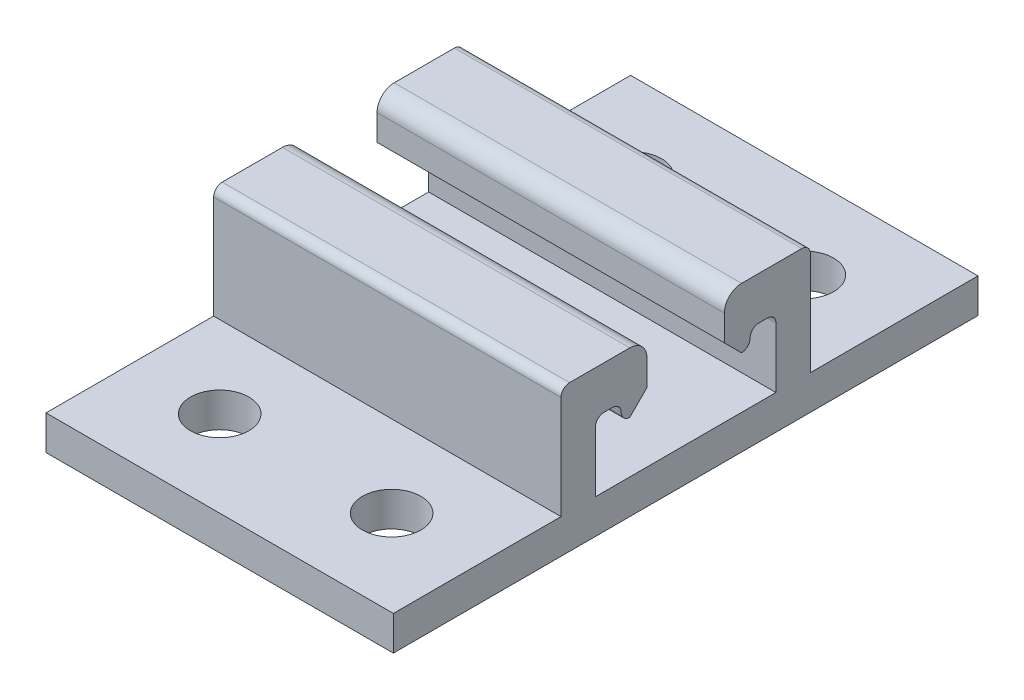
ISO-10303-21;
HEADER;
FILE_DESCRIPTION(('STEP AP214'),'2;1');
FILE_NAME('part.step','',(''),(''),'','','');
FILE_SCHEMA(('AUTOMOTIVE_DESIGN { 1 0 10303 214 1 1 1 1 }'));
ENDSEC;
DATA;
#1=APPLICATION_CONTEXT('core data for automotive mechanical design processes');
#2=APPLICATION_PROTOCOL_DEFINITION('international standard','automotive_design',2000,#1);
#3=PRODUCT_CONTEXT('',#1,'mechanical');
#4=PRODUCT('Part','Part','',(#3));
#5=PRODUCT_RELATED_PRODUCT_CATEGORY('part','',(#4));
#6=PRODUCT_DEFINITION_FORMATION('','',#4);
#7=PRODUCT_DEFINITION_CONTEXT('part definition',#1,'design');
#8=PRODUCT_DEFINITION('design','',#6,#7);
#9=PRODUCT_DEFINITION_SHAPE('','',#8);
#10=(LENGTH_UNIT() NAMED_UNIT(*) SI_UNIT(.MILLI.,.METRE.));
#11=(NAMED_UNIT(*) PLANE_ANGLE_UNIT() SI_UNIT($,.RADIAN.));
#12=(NAMED_UNIT(*) SI_UNIT($,.STERADIAN.) SOLID_ANGLE_UNIT());
#13=UNCERTAINTY_MEASURE_WITH_UNIT(LENGTH_MEASURE(1.E-05),#10,'distance_accuracy_value','');
#14=(GEOMETRIC_REPRESENTATION_CONTEXT(3) GLOBAL_UNCERTAINTY_ASSIGNED_CONTEXT((#13)) GLOBAL_UNIT_ASSIGNED_CONTEXT((#10,
#11,#12)) REPRESENTATION_CONTEXT('',''));
#15=CARTESIAN_POINT('',(0.,0.,0.));
#16=DIRECTION('',(0.,0.,1.));
#17=DIRECTION('',(1.,0.,0.));
#18=AXIS2_PLACEMENT_3D('',#15,#16,#17);
#19=CARTESIAN_POINT('',(0.,0.,0.));
#20=DIRECTION('',(0.,-1.,0.));
#21=DIRECTION('',(0.,0.,-1.));
#22=AXIS2_PLACEMENT_3D('',#19,#20,#21);
#23=PLANE('',#22);
#24=DIRECTION('',(0.,0.,-1.));
#25=VECTOR('',#24,1.);
#26=CARTESIAN_POINT('',(10.1,0.,17.));
#27=LINE('',#26,#25);
#28=CARTESIAN_POINT('',(10.1,0.,17.));
#29=VERTEX_POINT('',#28);
#30=CARTESIAN_POINT('',(10.1,0.,-17.));
#31=VERTEX_POINT('',#30);
#32=EDGE_CURVE('E325',#29,#31,#27,.T.);
#33=ORIENTED_EDGE('',*,*,#32,.F.);
#34=DIRECTION('',(1.,0.,0.));
#35=VECTOR('',#34,1.);
#36=CARTESIAN_POINT('',(-10.1,0.,17.));
#37=LINE('',#36,#35);
#38=CARTESIAN_POINT('',(-10.1,0.,17.));
#39=VERTEX_POINT('',#38);
#40=EDGE_CURVE('E343',#39,#29,#37,.T.);
#41=ORIENTED_EDGE('',*,*,#40,.F.);
#42=DIRECTION('',(0.,0.,1.));
#43=VECTOR('',#42,1.);
#44=CARTESIAN_POINT('',(-10.1,0.,17.));
#45=LINE('',#44,#43);
#46=CARTESIAN_POINT('',(-10.1,0.,-17.));
#47=VERTEX_POINT('',#46);
#48=EDGE_CURVE('E336',#47,#39,#45,.T.);
#49=ORIENTED_EDGE('',*,*,#48,.F.);
#50=DIRECTION('',(-1.,0.,0.));
#51=VECTOR('',#50,1.);
#52=CARTESIAN_POINT('',(-10.1,0.,-17.));
#53=LINE('',#52,#51);
#54=EDGE_CURVE('E331',#31,#47,#53,.T.);
#55=ORIENTED_EDGE('',*,*,#54,.F.);
#56=EDGE_LOOP('',(#33,#41,#49,#55));
#57=FACE_BOUND('',#56,.T.);
#58=CARTESIAN_POINT('',(5.,0.,12.));
#59=DIRECTION('',(0.,1.,0.));
#60=DIRECTION('',(0.,0.,1.));
#61=AXIS2_PLACEMENT_3D('',#58,#59,#60);
#62=CIRCLE('',#61,1.7);
#63=CARTESIAN_POINT('',(5.,0.,13.7));
#64=VERTEX_POINT('',#63);
#65=EDGE_CURVE('E266',#64,#64,#62,.T.);
#66=ORIENTED_EDGE('',*,*,#65,.T.);
#67=EDGE_LOOP('',(#66));
#68=FACE_BOUND('',#67,.T.);
#69=CARTESIAN_POINT('',(-5.,0.,12.));
#70=DIRECTION('',(0.,1.,0.));
#71=DIRECTION('',(0.,0.,1.));
#72=AXIS2_PLACEMENT_3D('',#69,#70,#71);
#73=CIRCLE('',#72,1.7);
#74=CARTESIAN_POINT('',(-5.,0.,13.7));
#75=VERTEX_POINT('',#74);
#76=EDGE_CURVE('E260',#75,#75,#73,.T.);
#77=ORIENTED_EDGE('',*,*,#76,.T.);
#78=EDGE_LOOP('',(#77));
#79=FACE_BOUND('',#78,.T.);
#80=CARTESIAN_POINT('',(5.,0.,-12.));
#81=DIRECTION('',(0.,1.,0.));
#82=DIRECTION('',(0.,0.,1.));
#83=AXIS2_PLACEMENT_3D('',#80,#81,#82);
#84=CIRCLE('',#83,1.7);
#85=CARTESIAN_POINT('',(5.,0.,-10.3));
#86=VERTEX_POINT('',#85);
#87=EDGE_CURVE('E414',#86,#86,#84,.T.);
#88=ORIENTED_EDGE('',*,*,#87,.T.);
#89=EDGE_LOOP('',(#88));
#90=FACE_BOUND('',#89,.T.);
#91=CARTESIAN_POINT('',(-5.,0.,-12.));
#92=DIRECTION('',(0.,1.,0.));
#93=DIRECTION('',(0.,0.,1.));
#94=AXIS2_PLACEMENT_3D('',#91,#92,#93);
#95=CIRCLE('',#94,1.7);
#96=CARTESIAN_POINT('',(-5.,0.,-10.3));
#97=VERTEX_POINT('',#96);
#98=EDGE_CURVE('E695',#97,#97,#95,.T.);
#99=ORIENTED_EDGE('',*,*,#98,.T.);
#100=EDGE_LOOP('',(#99));
#101=FACE_BOUND('',#100,.T.);
#102=ADVANCED_FACE('F34',(#57,#68,#79,#90,#101),#23,.T.);
#103=CARTESIAN_POINT('',(0.,2.,0.));
#104=DIRECTION('',(0.,-1.,0.));
#105=DIRECTION('',(0.,0.,-1.));
#106=AXIS2_PLACEMENT_3D('',#103,#104,#105);
#107=PLANE('',#106);
#108=DIRECTION('',(1.,0.,0.));
#109=VECTOR('',#108,1.);
#110=CARTESIAN_POINT('',(-18.3006097334284,2.,-5.25));
#111=LINE('',#110,#109);
#112=CARTESIAN_POINT('',(-10.1,2.,-5.25));
#113=VERTEX_POINT('',#112);
#114=CARTESIAN_POINT('',(10.1,2.,-5.25));
#115=VERTEX_POINT('',#114);
#116=EDGE_CURVE('E223',#113,#115,#111,.T.);
#117=ORIENTED_EDGE('',*,*,#116,.F.);
#118=DIRECTION('',(0.,0.,1.));
#119=VECTOR('',#118,1.);
#120=CARTESIAN_POINT('',(-10.1,2.,17.));
#121=LINE('',#120,#119);
#122=CARTESIAN_POINT('',(-10.1,2.,5.25));
#123=VERTEX_POINT('',#122);
#124=EDGE_CURVE('E233',#113,#123,#121,.T.);
#125=ORIENTED_EDGE('',*,*,#124,.T.);
#126=DIRECTION('',(1.,0.,0.));
#127=VECTOR('',#126,1.);
#128=CARTESIAN_POINT('',(-18.3006097334284,2.,5.25));
#129=LINE('',#128,#127);
#130=CARTESIAN_POINT('',(10.1,2.,5.25));
#131=VERTEX_POINT('',#130);
#132=EDGE_CURVE('E294',#123,#131,#129,.T.);
#133=ORIENTED_EDGE('',*,*,#132,.T.);
#134=DIRECTION('',(0.,0.,-1.));
#135=VECTOR('',#134,1.);
#136=CARTESIAN_POINT('',(10.1,2.,17.));
#137=LINE('',#136,#135);
#138=EDGE_CURVE('E244',#131,#115,#137,.T.);
#139=ORIENTED_EDGE('',*,*,#138,.T.);
#140=EDGE_LOOP('',(#117,#125,#133,#139));
#141=FACE_BOUND('',#140,.T.);
#142=ADVANCED_FACE('F242',(#141),#107,.F.);
#143=CARTESIAN_POINT('',(-5.,2.,-12.));
#144=DIRECTION('',(0.,1.,0.));
#145=DIRECTION('',(0.,0.,1.));
#146=AXIS2_PLACEMENT_3D('',#143,#144,#145);
#147=CIRCLE('',#146,1.69999999999999);
#148=CARTESIAN_POINT('',(-5.,2.,-10.3));
#149=VERTEX_POINT('',#148);
#150=EDGE_CURVE('E690',#149,#149,#147,.T.);
#151=ORIENTED_EDGE('',*,*,#150,.F.);
#152=EDGE_LOOP('',(#151));
#153=FACE_BOUND('',#152,.T.);
#154=CARTESIAN_POINT('',(5.,2.,-12.));
#155=DIRECTION('',(0.,1.,0.));
#156=DIRECTION('',(0.,0.,1.));
#157=AXIS2_PLACEMENT_3D('',#154,#155,#156);
#158=CIRCLE('',#157,1.69999999999999);
#159=CARTESIAN_POINT('',(5.,2.,-10.3));
#160=VERTEX_POINT('',#159);
#161=EDGE_CURVE('E693',#160,#160,#158,.T.);
#162=ORIENTED_EDGE('',*,*,#161,.F.);
#163=EDGE_LOOP('',(#162));
#164=FACE_BOUND('',#163,.T.);
#165=DIRECTION('',(1.,0.,0.));
#166=VECTOR('',#165,1.);
#167=CARTESIAN_POINT('',(-18.3006097334284,2.,-7.25));
#168=LINE('',#167,#166);
#169=CARTESIAN_POINT('',(-10.1,2.,-7.25));
#170=VERTEX_POINT('',#169);
#171=CARTESIAN_POINT('',(10.1,2.,-7.25));
#172=VERTEX_POINT('',#171);
#173=EDGE_CURVE('E245',#170,#172,#168,.T.);
#174=ORIENTED_EDGE('',*,*,#173,.T.);
#175=CARTESIAN_POINT('',(10.1,2.,-17.));
#176=VERTEX_POINT('',#175);
#177=EDGE_CURVE('E345',#172,#176,#137,.T.);
#178=ORIENTED_EDGE('',*,*,#177,.T.);
#179=DIRECTION('',(-1.,0.,0.));
#180=VECTOR('',#179,1.);
#181=CARTESIAN_POINT('',(-10.1,2.,-17.));
#182=LINE('',#181,#180);
#183=CARTESIAN_POINT('',(-10.1,2.,-17.));
#184=VERTEX_POINT('',#183);
#185=EDGE_CURVE('E359',#176,#184,#182,.T.);
#186=ORIENTED_EDGE('',*,*,#185,.T.);
#187=EDGE_CURVE('E239',#184,#170,#121,.T.);
#188=ORIENTED_EDGE('',*,*,#187,.T.);
#189=EDGE_LOOP('',(#174,#178,#186,#188));
#190=FACE_BOUND('',#189,.T.);
#191=ADVANCED_FACE('F478',(#153,#164,#190),#107,.F.);
#192=CARTESIAN_POINT('',(-5.,2.,12.));
#193=DIRECTION('',(0.,1.,0.));
#194=DIRECTION('',(0.,0.,1.));
#195=AXIS2_PLACEMENT_3D('',#192,#193,#194);
#196=CIRCLE('',#195,1.69999999999999);
#197=CARTESIAN_POINT('',(-5.,2.,13.7));
#198=VERTEX_POINT('',#197);
#199=EDGE_CURVE('E257',#198,#198,#196,.T.);
#200=ORIENTED_EDGE('',*,*,#199,.F.);
#201=EDGE_LOOP('',(#200));
#202=FACE_BOUND('',#201,.T.);
#203=CARTESIAN_POINT('',(5.,2.,12.));
#204=DIRECTION('',(0.,1.,0.));
#205=DIRECTION('',(0.,0.,1.));
#206=AXIS2_PLACEMENT_3D('',#203,#204,#205);
#207=CIRCLE('',#206,1.69999999999999);
#208=CARTESIAN_POINT('',(5.,2.,13.7));
#209=VERTEX_POINT('',#208);
#210=EDGE_CURVE('E263',#209,#209,#207,.T.);
#211=ORIENTED_EDGE('',*,*,#210,.F.);
#212=EDGE_LOOP('',(#211));
#213=FACE_BOUND('',#212,.T.);
#214=DIRECTION('',(1.,0.,0.));
#215=VECTOR('',#214,1.);
#216=CARTESIAN_POINT('',(-18.3006097334284,2.,7.25));
#217=LINE('',#216,#215);
#218=CARTESIAN_POINT('',(-10.1,2.,7.25));
#219=VERTEX_POINT('',#218);
#220=CARTESIAN_POINT('',(10.1,2.,7.25));
#221=VERTEX_POINT('',#220);
#222=EDGE_CURVE('E288',#219,#221,#217,.T.);
#223=ORIENTED_EDGE('',*,*,#222,.F.);
#224=CARTESIAN_POINT('',(-10.1,2.,17.));
#225=VERTEX_POINT('',#224);
#226=EDGE_CURVE('E240',#219,#225,#121,.T.);
#227=ORIENTED_EDGE('',*,*,#226,.T.);
#228=DIRECTION('',(1.,0.,0.));
#229=VECTOR('',#228,1.);
#230=CARTESIAN_POINT('',(-10.1,2.,17.));
#231=LINE('',#230,#229);
#232=CARTESIAN_POINT('',(10.1,2.,17.));
#233=VERTEX_POINT('',#232);
#234=EDGE_CURVE('E339',#225,#233,#231,.T.);
#235=ORIENTED_EDGE('',*,*,#234,.T.);
#236=EDGE_CURVE('E356',#233,#221,#137,.T.);
#237=ORIENTED_EDGE('',*,*,#236,.T.);
#238=EDGE_LOOP('',(#223,#227,#235,#237));
#239=FACE_BOUND('',#238,.T.);
#240=ADVANCED_FACE('F480',(#202,#213,#239),#107,.F.);
#241=CARTESIAN_POINT('',(10.1,2.,17.));
#242=DIRECTION('',(-1.,0.,0.));
#243=DIRECTION('',(0.,0.,1.));
#244=AXIS2_PLACEMENT_3D('',#241,#242,#243);
#245=PLANE('',#244);
#246=DIRECTION('',(0.,0.,-1.));
#247=VECTOR('',#246,1.);
#248=CARTESIAN_POINT('',(10.1,8.5,-7.25));
#249=LINE('',#248,#247);
#250=CARTESIAN_POINT('',(10.1,8.5,-3.25));
#251=VERTEX_POINT('',#250);
#252=CARTESIAN_POINT('',(10.1,8.5,-6.75));
#253=VERTEX_POINT('',#252);
#254=EDGE_CURVE('E420',#251,#253,#249,.T.);
#255=ORIENTED_EDGE('',*,*,#254,.F.);
#256=CARTESIAN_POINT('',(10.1,7.5,-3.25));
#257=DIRECTION('',(-1.,0.,0.));
#258=DIRECTION('',(0.,0.,1.));
#259=AXIS2_PLACEMENT_3D('',#256,#257,#258);
#260=CIRCLE('',#259,1.);
#261=CARTESIAN_POINT('',(10.1,7.5,-2.25));
#262=VERTEX_POINT('',#261);
#263=EDGE_CURVE('E56',#251,#262,#260,.F.);
#264=ORIENTED_EDGE('',*,*,#263,.T.);
#265=DIRECTION('',(0.,1.,0.));
#266=VECTOR('',#265,1.);
#267=CARTESIAN_POINT('',(10.1,8.5,-2.25));
#268=LINE('',#267,#266);
#269=CARTESIAN_POINT('',(10.1,6.00000000000001,-2.25));
#270=VERTEX_POINT('',#269);
#271=EDGE_CURVE('E427',#270,#262,#268,.T.);
#272=ORIENTED_EDGE('',*,*,#271,.F.);
#273=DIRECTION('',(0.,0.707106781186549,0.707106781186546));
#274=VECTOR('',#273,1.);
#275=CARTESIAN_POINT('',(10.1,6.00000000000001,-2.25));
#276=LINE('',#275,#274);
#277=CARTESIAN_POINT('',(10.1,5.,-3.25));
#278=VERTEX_POINT('',#277);
#279=EDGE_CURVE('E371',#270,#278,#276,.F.);
#280=ORIENTED_EDGE('',*,*,#279,.T.);
#281=CARTESIAN_POINT('',(10.1,5.5,-3.25));
#282=DIRECTION('',(-1.,0.,0.));
#283=DIRECTION('',(0.,0.,1.));
#284=AXIS2_PLACEMENT_3D('',#281,#282,#283);
#285=CIRCLE('',#284,0.5);
#286=CARTESIAN_POINT('',(10.1,5.5,-3.75));
#287=VERTEX_POINT('',#286);
#288=EDGE_CURVE('E384',#278,#287,#285,.F.);
#289=ORIENTED_EDGE('',*,*,#288,.T.);
#290=CARTESIAN_POINT('',(10.1,5.5,-4.25));
#291=DIRECTION('',(-1.,0.,0.));
#292=DIRECTION('',(0.,0.,1.));
#293=AXIS2_PLACEMENT_3D('',#290,#291,#292);
#294=CIRCLE('',#293,0.5);
#295=CARTESIAN_POINT('',(10.1,6.,-4.25));
#296=VERTEX_POINT('',#295);
#297=EDGE_CURVE('E405',#287,#296,#294,.T.);
#298=ORIENTED_EDGE('',*,*,#297,.T.);
#299=DIRECTION('',(0.,0.,1.));
#300=VECTOR('',#299,1.);
#301=CARTESIAN_POINT('',(10.1,6.,-5.25));
#302=LINE('',#301,#300);
#303=CARTESIAN_POINT('',(10.1,6.,-4.75));
#304=VERTEX_POINT('',#303);
#305=EDGE_CURVE('E251',#304,#296,#302,.T.);
#306=ORIENTED_EDGE('',*,*,#305,.F.);
#307=CARTESIAN_POINT('',(10.1,5.5,-4.75));
#308=DIRECTION('',(-1.,0.,0.));
#309=DIRECTION('',(0.,0.,1.));
#310=AXIS2_PLACEMENT_3D('',#307,#308,#309);
#311=CIRCLE('',#310,0.5);
#312=CARTESIAN_POINT('',(10.1,5.5,-5.25));
#313=VERTEX_POINT('',#312);
#314=EDGE_CURVE('E401',#304,#313,#311,.T.);
#315=ORIENTED_EDGE('',*,*,#314,.T.);
#316=DIRECTION('',(0.,1.,0.));
#317=VECTOR('',#316,1.);
#318=CARTESIAN_POINT('',(10.1,6.,-5.25));
#319=LINE('',#318,#317);
#320=EDGE_CURVE('E246',#115,#313,#319,.T.);
#321=ORIENTED_EDGE('',*,*,#320,.F.);
#322=ORIENTED_EDGE('',*,*,#138,.F.);
#323=DIRECTION('',(0.,1.,0.));
#324=VECTOR('',#323,1.);
#325=CARTESIAN_POINT('',(10.1,6.,5.25));
#326=LINE('',#325,#324);
#327=CARTESIAN_POINT('',(10.1,5.5,5.25));
#328=VERTEX_POINT('',#327);
#329=EDGE_CURVE('E283',#131,#328,#326,.T.);
#330=ORIENTED_EDGE('',*,*,#329,.T.);
#331=CARTESIAN_POINT('',(10.1,5.5,4.75));
#332=DIRECTION('',(-1.,0.,0.));
#333=DIRECTION('',(0.,0.,1.));
#334=AXIS2_PLACEMENT_3D('',#331,#332,#333);
#335=CIRCLE('',#334,0.5);
#336=CARTESIAN_POINT('',(10.1,6.,4.75));
#337=VERTEX_POINT('',#336);
#338=EDGE_CURVE('E627',#328,#337,#335,.T.);
#339=ORIENTED_EDGE('',*,*,#338,.T.);
#340=DIRECTION('',(0.,0.,-1.));
#341=VECTOR('',#340,1.);
#342=CARTESIAN_POINT('',(10.1,6.,5.25));
#343=LINE('',#342,#341);
#344=CARTESIAN_POINT('',(10.1,6.,4.25));
#345=VERTEX_POINT('',#344);
#346=EDGE_CURVE('E279',#337,#345,#343,.T.);
#347=ORIENTED_EDGE('',*,*,#346,.T.);
#348=CARTESIAN_POINT('',(10.1,5.5,4.25));
#349=DIRECTION('',(-1.,0.,0.));
#350=DIRECTION('',(0.,0.,1.));
#351=AXIS2_PLACEMENT_3D('',#348,#349,#350);
#352=CIRCLE('',#351,0.5);
#353=CARTESIAN_POINT('',(10.1,5.5,3.75));
#354=VERTEX_POINT('',#353);
#355=EDGE_CURVE('E631',#345,#354,#352,.T.);
#356=ORIENTED_EDGE('',*,*,#355,.T.);
#357=CARTESIAN_POINT('',(10.1,5.5,3.25));
#358=DIRECTION('',(-1.,0.,0.));
#359=DIRECTION('',(0.,0.,1.));
#360=AXIS2_PLACEMENT_3D('',#357,#358,#359);
#361=CIRCLE('',#360,0.5);
#362=CARTESIAN_POINT('',(10.1,5.,3.25));
#363=VERTEX_POINT('',#362);
#364=EDGE_CURVE('E660',#354,#363,#361,.F.);
#365=ORIENTED_EDGE('',*,*,#364,.T.);
#366=DIRECTION('',(0.,-0.707106781186549,0.707106781186546));
#367=VECTOR('',#366,1.);
#368=CARTESIAN_POINT('',(10.1,5.,3.25));
#369=LINE('',#368,#367);
#370=CARTESIAN_POINT('',(10.1,6.00000000000001,2.25));
#371=VERTEX_POINT('',#370);
#372=EDGE_CURVE('E307',#363,#371,#369,.F.);
#373=ORIENTED_EDGE('',*,*,#372,.T.);
#374=DIRECTION('',(0.,1.,0.));
#375=VECTOR('',#374,1.);
#376=CARTESIAN_POINT('',(10.1,8.5,2.25));
#377=LINE('',#376,#375);
#378=CARTESIAN_POINT('',(10.1,7.5,2.25));
#379=VERTEX_POINT('',#378);
#380=EDGE_CURVE('E282',#371,#379,#377,.T.);
#381=ORIENTED_EDGE('',*,*,#380,.T.);
#382=CARTESIAN_POINT('',(10.1,7.5,3.25));
#383=DIRECTION('',(-1.,0.,0.));
#384=DIRECTION('',(0.,0.,1.));
#385=AXIS2_PLACEMENT_3D('',#382,#383,#384);
#386=CIRCLE('',#385,1.);
#387=CARTESIAN_POINT('',(10.1,8.5,3.25));
#388=VERTEX_POINT('',#387);
#389=EDGE_CURVE('E640',#379,#388,#386,.F.);
#390=ORIENTED_EDGE('',*,*,#389,.T.);
#391=DIRECTION('',(0.,0.,1.));
#392=VECTOR('',#391,1.);
#393=CARTESIAN_POINT('',(10.1,8.5,7.25));
#394=LINE('',#393,#392);
#395=CARTESIAN_POINT('',(10.1,8.5,6.75));
#396=VERTEX_POINT('',#395);
#397=EDGE_CURVE('E286',#388,#396,#394,.T.);
#398=ORIENTED_EDGE('',*,*,#397,.T.);
#399=CARTESIAN_POINT('',(10.1,8.,6.75));
#400=DIRECTION('',(-1.,0.,0.));
#401=DIRECTION('',(0.,0.,1.));
#402=AXIS2_PLACEMENT_3D('',#399,#400,#401);
#403=CIRCLE('',#402,0.5);
#404=CARTESIAN_POINT('',(10.1,8.,7.25));
#405=VERTEX_POINT('',#404);
#406=EDGE_CURVE('E316',#396,#405,#403,.F.);
#407=ORIENTED_EDGE('',*,*,#406,.T.);
#408=DIRECTION('',(0.,-1.,0.));
#409=VECTOR('',#408,1.);
#410=CARTESIAN_POINT('',(10.1,2.,7.25));
#411=LINE('',#410,#409);
#412=EDGE_CURVE('E301',#405,#221,#411,.T.);
#413=ORIENTED_EDGE('',*,*,#412,.T.);
#414=ORIENTED_EDGE('',*,*,#236,.F.);
#415=DIRECTION('',(0.,-1.,0.));
#416=VECTOR('',#415,1.);
#417=CARTESIAN_POINT('',(10.1,2.,17.));
#418=LINE('',#417,#416);
#419=EDGE_CURVE('E346',#233,#29,#418,.T.);
#420=ORIENTED_EDGE('',*,*,#419,.T.);
#421=ORIENTED_EDGE('',*,*,#32,.T.);
#422=DIRECTION('',(0.,-1.,0.));
#423=VECTOR('',#422,1.);
#424=CARTESIAN_POINT('',(10.1,2.,-17.));
#425=LINE('',#424,#423);
#426=EDGE_CURVE('E308',#176,#31,#425,.T.);
#427=ORIENTED_EDGE('',*,*,#426,.F.);
#428=ORIENTED_EDGE('',*,*,#177,.F.);
#429=DIRECTION('',(0.,-1.,0.));
#430=VECTOR('',#429,1.);
#431=CARTESIAN_POINT('',(10.1,2.,-7.25));
#432=LINE('',#431,#430);
#433=CARTESIAN_POINT('',(10.1,8.,-7.25));
#434=VERTEX_POINT('',#433);
#435=EDGE_CURVE('E413',#434,#172,#432,.T.);
#436=ORIENTED_EDGE('',*,*,#435,.F.);
#437=CARTESIAN_POINT('',(10.1,8.,-6.75));
#438=DIRECTION('',(-1.,0.,0.));
#439=DIRECTION('',(0.,0.,1.));
#440=AXIS2_PLACEMENT_3D('',#437,#438,#439);
#441=CIRCLE('',#440,0.5);
#442=EDGE_CURVE('E381',#434,#253,#441,.F.);
#443=ORIENTED_EDGE('',*,*,#442,.T.);
#444=EDGE_LOOP('',(#255,#264,#272,#280,#289,#298,#306,#315,#321,#322,#330,#339,#347,#356,#365,
#373,#381,#390,#398,#407,#413,#414,#420,#421,#427,#428,#436,#443));
#445=FACE_BOUND('',#444,.T.);
#446=ADVANCED_FACE('F424',(#445),#245,.F.);
#447=CARTESIAN_POINT('',(-10.1,2.,-17.));
#448=DIRECTION('',(0.,0.,1.));
#449=DIRECTION('',(1.,0.,0.));
#450=AXIS2_PLACEMENT_3D('',#447,#448,#449);
#451=PLANE('',#450);
#452=ORIENTED_EDGE('',*,*,#54,.T.);
#453=DIRECTION('',(0.,-1.,0.));
#454=VECTOR('',#453,1.);
#455=CARTESIAN_POINT('',(-10.1,2.,-17.));
#456=LINE('',#455,#454);
#457=EDGE_CURVE('E351',#184,#47,#456,.T.);
#458=ORIENTED_EDGE('',*,*,#457,.F.);
#459=ORIENTED_EDGE('',*,*,#185,.F.);
#460=ORIENTED_EDGE('',*,*,#426,.T.);
#461=EDGE_LOOP('',(#452,#458,#459,#460));
#462=FACE_BOUND('',#461,.T.);
#463=ADVANCED_FACE('F491',(#462),#451,.F.);
#464=CARTESIAN_POINT('',(-10.1,2.,17.));
#465=DIRECTION('',(1.,0.,0.));
#466=DIRECTION('',(0.,0.,-1.));
#467=AXIS2_PLACEMENT_3D('',#464,#465,#466);
#468=PLANE('',#467);
#469=DIRECTION('',(0.,-1.,0.));
#470=VECTOR('',#469,1.);
#471=CARTESIAN_POINT('',(-10.1,8.5,-2.25));
#472=LINE('',#471,#470);
#473=CARTESIAN_POINT('',(-10.1,7.5,-2.25));
#474=VERTEX_POINT('',#473);
#475=CARTESIAN_POINT('',(-10.1,6.00000000000001,-2.25));
#476=VERTEX_POINT('',#475);
#477=EDGE_CURVE('E256',#474,#476,#472,.T.);
#478=ORIENTED_EDGE('',*,*,#477,.F.);
#479=CARTESIAN_POINT('',(-10.1,7.5,-3.25));
#480=DIRECTION('',(1.,0.,0.));
#481=DIRECTION('',(0.,0.,-1.));
#482=AXIS2_PLACEMENT_3D('',#479,#480,#481);
#483=CIRCLE('',#482,1.);
#484=CARTESIAN_POINT('',(-10.1,8.5,-3.25));
#485=VERTEX_POINT('',#484);
#486=EDGE_CURVE('E11',#474,#485,#483,.F.);
#487=ORIENTED_EDGE('',*,*,#486,.T.);
#488=DIRECTION('',(0.,0.,1.));
#489=VECTOR('',#488,1.);
#490=CARTESIAN_POINT('',(-10.1,8.5,-7.25));
#491=LINE('',#490,#489);
#492=CARTESIAN_POINT('',(-10.1,8.5,-6.75));
#493=VERTEX_POINT('',#492);
#494=EDGE_CURVE('E249',#493,#485,#491,.T.);
#495=ORIENTED_EDGE('',*,*,#494,.F.);
#496=CARTESIAN_POINT('',(-10.1,8.,-6.75));
#497=DIRECTION('',(1.,0.,0.));
#498=DIRECTION('',(0.,0.,-1.));
#499=AXIS2_PLACEMENT_3D('',#496,#497,#498);
#500=CIRCLE('',#499,0.5);
#501=CARTESIAN_POINT('',(-10.1,8.,-7.25));
#502=VERTEX_POINT('',#501);
#503=EDGE_CURVE('E386',#493,#502,#500,.F.);
#504=ORIENTED_EDGE('',*,*,#503,.T.);
#505=DIRECTION('',(0.,1.,0.));
#506=VECTOR('',#505,1.);
#507=CARTESIAN_POINT('',(-10.1,2.,-7.25));
#508=LINE('',#507,#506);
#509=EDGE_CURVE('E229',#170,#502,#508,.T.);
#510=ORIENTED_EDGE('',*,*,#509,.F.);
#511=ORIENTED_EDGE('',*,*,#187,.F.);
#512=ORIENTED_EDGE('',*,*,#457,.T.);
#513=ORIENTED_EDGE('',*,*,#48,.T.);
#514=DIRECTION('',(0.,-1.,0.));
#515=VECTOR('',#514,1.);
#516=CARTESIAN_POINT('',(-10.1,2.,17.));
#517=LINE('',#516,#515);
#518=EDGE_CURVE('E348',#225,#39,#517,.T.);
#519=ORIENTED_EDGE('',*,*,#518,.F.);
#520=ORIENTED_EDGE('',*,*,#226,.F.);
#521=DIRECTION('',(0.,1.,0.));
#522=VECTOR('',#521,1.);
#523=CARTESIAN_POINT('',(-10.1,2.,7.25));
#524=LINE('',#523,#522);
#525=CARTESIAN_POINT('',(-10.1,8.,7.25));
#526=VERTEX_POINT('',#525);
#527=EDGE_CURVE('E278',#219,#526,#524,.T.);
#528=ORIENTED_EDGE('',*,*,#527,.T.);
#529=CARTESIAN_POINT('',(-10.1,8.,6.75));
#530=DIRECTION('',(1.,0.,0.));
#531=DIRECTION('',(0.,0.,-1.));
#532=AXIS2_PLACEMENT_3D('',#529,#530,#531);
#533=CIRCLE('',#532,0.5);
#534=CARTESIAN_POINT('',(-10.1,8.5,6.75));
#535=VERTEX_POINT('',#534);
#536=EDGE_CURVE('E613',#526,#535,#533,.F.);
#537=ORIENTED_EDGE('',*,*,#536,.T.);
#538=DIRECTION('',(0.,0.,-1.));
#539=VECTOR('',#538,1.);
#540=CARTESIAN_POINT('',(-10.1,8.5,7.25));
#541=LINE('',#540,#539);
#542=CARTESIAN_POINT('',(-10.1,8.5,3.25));
#543=VERTEX_POINT('',#542);
#544=EDGE_CURVE('E275',#535,#543,#541,.T.);
#545=ORIENTED_EDGE('',*,*,#544,.T.);
#546=CARTESIAN_POINT('',(-10.1,7.5,3.25));
#547=DIRECTION('',(1.,0.,0.));
#548=DIRECTION('',(0.,0.,-1.));
#549=AXIS2_PLACEMENT_3D('',#546,#547,#548);
#550=CIRCLE('',#549,1.);
#551=CARTESIAN_POINT('',(-10.1,7.5,2.25));
#552=VERTEX_POINT('',#551);
#553=EDGE_CURVE('E372',#543,#552,#550,.F.);
#554=ORIENTED_EDGE('',*,*,#553,.T.);
#555=DIRECTION('',(0.,-1.,0.));
#556=VECTOR('',#555,1.);
#557=CARTESIAN_POINT('',(-10.1,8.5,2.25));
#558=LINE('',#557,#556);
#559=CARTESIAN_POINT('',(-10.1,6.00000000000001,2.25));
#560=VERTEX_POINT('',#559);
#561=EDGE_CURVE('E273',#552,#560,#558,.T.);
#562=ORIENTED_EDGE('',*,*,#561,.T.);
#563=DIRECTION('',(0.,0.707106781186549,-0.707106781186546));
#564=VECTOR('',#563,1.);
#565=CARTESIAN_POINT('',(-10.1,5.,3.25));
#566=LINE('',#565,#564);
#567=CARTESIAN_POINT('',(-10.1,5.,3.25));
#568=VERTEX_POINT('',#567);
#569=EDGE_CURVE('E313',#560,#568,#566,.F.);
#570=ORIENTED_EDGE('',*,*,#569,.T.);
#571=CARTESIAN_POINT('',(-10.1,5.5,3.25));
#572=DIRECTION('',(1.,0.,0.));
#573=DIRECTION('',(0.,0.,-1.));
#574=AXIS2_PLACEMENT_3D('',#571,#572,#573);
#575=CIRCLE('',#574,0.5);
#576=CARTESIAN_POINT('',(-10.1,5.5,3.75));
#577=VERTEX_POINT('',#576);
#578=EDGE_CURVE('E620',#568,#577,#575,.F.);
#579=ORIENTED_EDGE('',*,*,#578,.T.);
#580=CARTESIAN_POINT('',(-10.1,5.5,4.25));
#581=DIRECTION('',(1.,0.,0.));
#582=DIRECTION('',(0.,0.,-1.));
#583=AXIS2_PLACEMENT_3D('',#580,#581,#582);
#584=CIRCLE('',#583,0.5);
#585=CARTESIAN_POINT('',(-10.1,6.,4.25));
#586=VERTEX_POINT('',#585);
#587=EDGE_CURVE('E633',#577,#586,#584,.T.);
#588=ORIENTED_EDGE('',*,*,#587,.T.);
#589=DIRECTION('',(0.,0.,1.));
#590=VECTOR('',#589,1.);
#591=CARTESIAN_POINT('',(-10.1,6.,5.25));
#592=LINE('',#591,#590);
#593=CARTESIAN_POINT('',(-10.1,6.,4.75));
#594=VERTEX_POINT('',#593);
#595=EDGE_CURVE('E270',#586,#594,#592,.T.);
#596=ORIENTED_EDGE('',*,*,#595,.T.);
#597=CARTESIAN_POINT('',(-10.1,5.5,4.75));
#598=DIRECTION('',(1.,0.,0.));
#599=DIRECTION('',(0.,0.,-1.));
#600=AXIS2_PLACEMENT_3D('',#597,#598,#599);
#601=CIRCLE('',#600,0.5);
#602=CARTESIAN_POINT('',(-10.1,5.5,5.25));
#603=VERTEX_POINT('',#602);
#604=EDGE_CURVE('E629',#594,#603,#601,.T.);
#605=ORIENTED_EDGE('',*,*,#604,.T.);
#606=DIRECTION('',(0.,-1.,0.));
#607=VECTOR('',#606,1.);
#608=CARTESIAN_POINT('',(-10.1,6.,5.25));
#609=LINE('',#608,#607);
#610=EDGE_CURVE('E236',#603,#123,#609,.T.);
#611=ORIENTED_EDGE('',*,*,#610,.T.);
#612=ORIENTED_EDGE('',*,*,#124,.F.);
#613=DIRECTION('',(0.,-1.,0.));
#614=VECTOR('',#613,1.);
#615=CARTESIAN_POINT('',(-10.1,6.,-5.25));
#616=LINE('',#615,#614);
#617=CARTESIAN_POINT('',(-10.1,5.5,-5.25));
#618=VERTEX_POINT('',#617);
#619=EDGE_CURVE('E218',#618,#113,#616,.T.);
#620=ORIENTED_EDGE('',*,*,#619,.F.);
#621=CARTESIAN_POINT('',(-10.1,5.5,-4.75));
#622=DIRECTION('',(1.,0.,0.));
#623=DIRECTION('',(0.,0.,-1.));
#624=AXIS2_PLACEMENT_3D('',#621,#622,#623);
#625=CIRCLE('',#624,0.5);
#626=CARTESIAN_POINT('',(-10.1,6.,-4.75));
#627=VERTEX_POINT('',#626);
#628=EDGE_CURVE('E403',#618,#627,#625,.T.);
#629=ORIENTED_EDGE('',*,*,#628,.T.);
#630=DIRECTION('',(0.,0.,-1.));
#631=VECTOR('',#630,1.);
#632=CARTESIAN_POINT('',(-10.1,6.,-5.25));
#633=LINE('',#632,#631);
#634=CARTESIAN_POINT('',(-10.1,6.,-4.25));
#635=VERTEX_POINT('',#634);
#636=EDGE_CURVE('E230',#635,#627,#633,.T.);
#637=ORIENTED_EDGE('',*,*,#636,.F.);
#638=CARTESIAN_POINT('',(-10.1,5.5,-4.25));
#639=DIRECTION('',(1.,0.,0.));
#640=DIRECTION('',(0.,0.,-1.));
#641=AXIS2_PLACEMENT_3D('',#638,#639,#640);
#642=CIRCLE('',#641,0.5);
#643=CARTESIAN_POINT('',(-10.1,5.5,-3.75));
#644=VERTEX_POINT('',#643);
#645=EDGE_CURVE('E407',#635,#644,#642,.T.);
#646=ORIENTED_EDGE('',*,*,#645,.T.);
#647=CARTESIAN_POINT('',(-10.1,5.5,-3.25));
#648=DIRECTION('',(1.,0.,0.));
#649=DIRECTION('',(0.,0.,-1.));
#650=AXIS2_PLACEMENT_3D('',#647,#648,#649);
#651=CIRCLE('',#650,0.5);
#652=CARTESIAN_POINT('',(-10.1,5.,-3.25));
#653=VERTEX_POINT('',#652);
#654=EDGE_CURVE('E388',#644,#653,#651,.F.);
#655=ORIENTED_EDGE('',*,*,#654,.T.);
#656=DIRECTION('',(0.,-0.707106781186549,-0.707106781186546));
#657=VECTOR('',#656,1.);
#658=CARTESIAN_POINT('',(-10.1,6.00000000000001,-2.25));
#659=LINE('',#658,#657);
#660=EDGE_CURVE('E378',#653,#476,#659,.F.);
#661=ORIENTED_EDGE('',*,*,#660,.T.);
#662=EDGE_LOOP('',(#478,#487,#495,#504,#510,#511,#512,#513,#519,#520,#528,#537,#545,#554,#562,
#570,#579,#588,#596,#605,#611,#612,#620,#629,#637,#646,#655,#661));
#663=FACE_BOUND('',#662,.T.);
#664=ADVANCED_FACE('F234',(#663),#468,.F.);
#665=CARTESIAN_POINT('',(-10.1,2.,17.));
#666=DIRECTION('',(0.,0.,-1.));
#667=DIRECTION('',(-1.,0.,0.));
#668=AXIS2_PLACEMENT_3D('',#665,#666,#667);
#669=PLANE('',#668);
#670=ORIENTED_EDGE('',*,*,#40,.T.);
#671=ORIENTED_EDGE('',*,*,#419,.F.);
#672=ORIENTED_EDGE('',*,*,#234,.F.);
#673=ORIENTED_EDGE('',*,*,#518,.T.);
#674=EDGE_LOOP('',(#670,#671,#672,#673));
#675=FACE_BOUND('',#674,.T.);
#676=ADVANCED_FACE('F484',(#675),#669,.F.);
#677=CARTESIAN_POINT('',(-18.3006097334284,2.,7.25));
#678=DIRECTION('',(0.,0.,1.));
#679=DIRECTION('',(0.,-1.,0.));
#680=AXIS2_PLACEMENT_3D('',#677,#678,#679);
#681=PLANE('',#680);
#682=ORIENTED_EDGE('',*,*,#412,.F.);
#683=DIRECTION('',(1.,0.,0.));
#684=VECTOR('',#683,1.);
#685=CARTESIAN_POINT('',(-18.3006097334284,8.,7.25));
#686=LINE('',#685,#684);
#687=EDGE_CURVE('E608',#405,#526,#686,.F.);
#688=ORIENTED_EDGE('',*,*,#687,.T.);
#689=ORIENTED_EDGE('',*,*,#527,.F.);
#690=ORIENTED_EDGE('',*,*,#222,.T.);
#691=EDGE_LOOP('',(#682,#688,#689,#690));
#692=FACE_BOUND('',#691,.T.);
#693=ADVANCED_FACE('F487',(#692),#681,.T.);
#694=CARTESIAN_POINT('',(-18.3006097334284,8.5,7.25));
#695=DIRECTION('',(0.,1.,0.));
#696=DIRECTION('',(0.,0.,1.));
#697=AXIS2_PLACEMENT_3D('',#694,#695,#696);
#698=PLANE('',#697);
#699=ORIENTED_EDGE('',*,*,#397,.F.);
#700=DIRECTION('',(1.,0.,0.));
#701=VECTOR('',#700,1.);
#702=CARTESIAN_POINT('',(-18.3006097334284,8.5,3.25));
#703=LINE('',#702,#701);
#704=EDGE_CURVE('E642',#388,#543,#703,.F.);
#705=ORIENTED_EDGE('',*,*,#704,.T.);
#706=ORIENTED_EDGE('',*,*,#544,.F.);
#707=DIRECTION('',(1.,0.,0.));
#708=VECTOR('',#707,1.);
#709=CARTESIAN_POINT('',(-18.3006097334284,8.5,6.75));
#710=LINE('',#709,#708);
#711=EDGE_CURVE('E615',#535,#396,#710,.T.);
#712=ORIENTED_EDGE('',*,*,#711,.T.);
#713=EDGE_LOOP('',(#699,#705,#706,#712));
#714=FACE_BOUND('',#713,.T.);
#715=ADVANCED_FACE('F587',(#714),#698,.T.);
#716=CARTESIAN_POINT('',(-18.3006097334284,8.5,2.25));
#717=DIRECTION('',(0.,0.,-1.));
#718=DIRECTION('',(0.,1.,0.));
#719=AXIS2_PLACEMENT_3D('',#716,#717,#718);
#720=PLANE('',#719);
#721=ORIENTED_EDGE('',*,*,#561,.F.);
#722=DIRECTION('',(1.,0.,0.));
#723=VECTOR('',#722,1.);
#724=CARTESIAN_POINT('',(-18.3006097334284,7.5,2.25));
#725=LINE('',#724,#723);
#726=EDGE_CURVE('E635',#552,#379,#725,.T.);
#727=ORIENTED_EDGE('',*,*,#726,.T.);
#728=ORIENTED_EDGE('',*,*,#380,.F.);
#729=DIRECTION('',(-1.,0.,0.));
#730=VECTOR('',#729,1.);
#731=CARTESIAN_POINT('',(-18.3006097334284,6.00000000000001,2.25));
#732=LINE('',#731,#730);
#733=EDGE_CURVE('E310',#371,#560,#732,.T.);
#734=ORIENTED_EDGE('',*,*,#733,.T.);
#735=EDGE_LOOP('',(#721,#727,#728,#734));
#736=FACE_BOUND('',#735,.T.);
#737=ADVANCED_FACE('F590',(#736),#720,.T.);
#738=CARTESIAN_POINT('',(-18.3006097334284,6.,5.25));
#739=DIRECTION('',(0.,-1.,0.));
#740=DIRECTION('',(0.,0.,-1.));
#741=AXIS2_PLACEMENT_3D('',#738,#739,#740);
#742=PLANE('',#741);
#743=ORIENTED_EDGE('',*,*,#346,.F.);
#744=DIRECTION('',(1.,0.,0.));
#745=VECTOR('',#744,1.);
#746=CARTESIAN_POINT('',(-10.1,6.,4.75));
#747=LINE('',#746,#745);
#748=EDGE_CURVE('E625',#337,#594,#747,.F.);
#749=ORIENTED_EDGE('',*,*,#748,.T.);
#750=ORIENTED_EDGE('',*,*,#595,.F.);
#751=DIRECTION('',(1.,0.,0.));
#752=VECTOR('',#751,1.);
#753=CARTESIAN_POINT('',(10.1,6.,4.25));
#754=LINE('',#753,#752);
#755=EDGE_CURVE('E618',#586,#345,#754,.T.);
#756=ORIENTED_EDGE('',*,*,#755,.T.);
#757=EDGE_LOOP('',(#743,#749,#750,#756));
#758=FACE_BOUND('',#757,.T.);
#759=ADVANCED_FACE('F594',(#758),#742,.T.);
#760=CARTESIAN_POINT('',(-18.3006097334284,6.,5.25));
#761=DIRECTION('',(0.,0.,-1.));
#762=DIRECTION('',(0.,1.,0.));
#763=AXIS2_PLACEMENT_3D('',#760,#761,#762);
#764=PLANE('',#763);
#765=ORIENTED_EDGE('',*,*,#610,.F.);
#766=DIRECTION('',(1.,0.,0.));
#767=VECTOR('',#766,1.);
#768=CARTESIAN_POINT('',(10.1,5.5,5.25));
#769=LINE('',#768,#767);
#770=EDGE_CURVE('E614',#603,#328,#769,.T.);
#771=ORIENTED_EDGE('',*,*,#770,.T.);
#772=ORIENTED_EDGE('',*,*,#329,.F.);
#773=ORIENTED_EDGE('',*,*,#132,.F.);
#774=EDGE_LOOP('',(#765,#771,#772,#773));
#775=FACE_BOUND('',#774,.T.);
#776=ADVANCED_FACE('F501',(#775),#764,.T.);
#777=CARTESIAN_POINT('',(-18.3006097334284,5.,3.25));
#778=DIRECTION('',(0.,0.707106781186546,0.707106781186549));
#779=DIRECTION('',(1.,0.,0.));
#780=AXIS2_PLACEMENT_3D('',#777,#778,#779);
#781=PLANE('',#780);
#782=ORIENTED_EDGE('',*,*,#569,.F.);
#783=ORIENTED_EDGE('',*,*,#733,.F.);
#784=ORIENTED_EDGE('',*,*,#372,.F.);
#785=DIRECTION('',(1.,0.,0.));
#786=VECTOR('',#785,1.);
#787=CARTESIAN_POINT('',(-18.3006097334284,5.,3.25));
#788=LINE('',#787,#786);
#789=EDGE_CURVE('E304',#568,#363,#788,.T.);
#790=ORIENTED_EDGE('',*,*,#789,.F.);
#791=EDGE_LOOP('',(#782,#783,#784,#790));
#792=FACE_BOUND('',#791,.T.);
#793=ADVANCED_FACE('F497',(#792),#781,.F.);
#794=CARTESIAN_POINT('',(-18.3006097334284,5.5,4.25));
#795=DIRECTION('',(-1.,0.,0.));
#796=DIRECTION('',(0.,0.,1.));
#797=AXIS2_PLACEMENT_3D('',#794,#795,#796);
#798=CYLINDRICAL_SURFACE('',#797,0.5);
#799=ORIENTED_EDGE('',*,*,#755,.F.);
#800=ORIENTED_EDGE('',*,*,#587,.F.);
#801=DIRECTION('',(1.,0.,0.));
#802=VECTOR('',#801,1.);
#803=CARTESIAN_POINT('',(-10.1,5.5,3.75));
#804=LINE('',#803,#802);
#805=EDGE_CURVE('E269',#354,#577,#804,.F.);
#806=ORIENTED_EDGE('',*,*,#805,.F.);
#807=ORIENTED_EDGE('',*,*,#355,.F.);
#808=EDGE_LOOP('',(#799,#800,#806,#807));
#809=FACE_BOUND('',#808,.T.);
#810=ADVANCED_FACE('F500',(#809),#798,.F.);
#811=CARTESIAN_POINT('',(-18.3006097334284,5.5,3.25));
#812=DIRECTION('',(1.,0.,0.));
#813=DIRECTION('',(0.,0.,-1.));
#814=AXIS2_PLACEMENT_3D('',#811,#812,#813);
#815=CYLINDRICAL_SURFACE('',#814,0.5);
#816=ORIENTED_EDGE('',*,*,#578,.F.);
#817=ORIENTED_EDGE('',*,*,#789,.T.);
#818=ORIENTED_EDGE('',*,*,#364,.F.);
#819=ORIENTED_EDGE('',*,*,#805,.T.);
#820=EDGE_LOOP('',(#816,#817,#818,#819));
#821=FACE_BOUND('',#820,.T.);
#822=ADVANCED_FACE('F503',(#821),#815,.T.);
#823=CARTESIAN_POINT('',(-18.3006097334284,8.,6.75));
#824=DIRECTION('',(1.,0.,0.));
#825=DIRECTION('',(0.,0.,-1.));
#826=AXIS2_PLACEMENT_3D('',#823,#824,#825);
#827=CYLINDRICAL_SURFACE('',#826,0.5);
#828=ORIENTED_EDGE('',*,*,#536,.F.);
#829=ORIENTED_EDGE('',*,*,#687,.F.);
#830=ORIENTED_EDGE('',*,*,#406,.F.);
#831=ORIENTED_EDGE('',*,*,#711,.F.);
#832=EDGE_LOOP('',(#828,#829,#830,#831));
#833=FACE_BOUND('',#832,.T.);
#834=ADVANCED_FACE('F506',(#833),#827,.T.);
#835=CARTESIAN_POINT('',(-18.3006097334284,5.5,4.75));
#836=DIRECTION('',(-1.,0.,0.));
#837=DIRECTION('',(0.,0.,1.));
#838=AXIS2_PLACEMENT_3D('',#835,#836,#837);
#839=CYLINDRICAL_SURFACE('',#838,0.5);
#840=ORIENTED_EDGE('',*,*,#604,.F.);
#841=ORIENTED_EDGE('',*,*,#748,.F.);
#842=ORIENTED_EDGE('',*,*,#338,.F.);
#843=ORIENTED_EDGE('',*,*,#770,.F.);
#844=EDGE_LOOP('',(#840,#841,#842,#843));
#845=FACE_BOUND('',#844,.T.);
#846=ADVANCED_FACE('F513',(#845),#839,.F.);
#847=CARTESIAN_POINT('',(-18.3006097334284,7.5,3.25));
#848=DIRECTION('',(1.,0.,0.));
#849=DIRECTION('',(0.,0.,-1.));
#850=AXIS2_PLACEMENT_3D('',#847,#848,#849);
#851=CYLINDRICAL_SURFACE('',#850,1.);
#852=ORIENTED_EDGE('',*,*,#553,.F.);
#853=ORIENTED_EDGE('',*,*,#704,.F.);
#854=ORIENTED_EDGE('',*,*,#389,.F.);
#855=ORIENTED_EDGE('',*,*,#726,.F.);
#856=EDGE_LOOP('',(#852,#853,#854,#855));
#857=FACE_BOUND('',#856,.T.);
#858=ADVANCED_FACE('F517',(#857),#851,.T.);
#859=CARTESIAN_POINT('',(5.,2.,12.));
#860=DIRECTION('',(0.,1.,0.));
#861=DIRECTION('',(0.,0.,1.));
#862=AXIS2_PLACEMENT_3D('',#859,#860,#861);
#863=CYLINDRICAL_SURFACE('',#862,1.69999999999999);
#864=ORIENTED_EDGE('',*,*,#65,.F.);
#865=EDGE_LOOP('',(#864));
#866=FACE_BOUND('',#865,.T.);
#867=ORIENTED_EDGE('',*,*,#210,.T.);
#868=EDGE_LOOP('',(#867));
#869=FACE_BOUND('',#868,.T.);
#870=ADVANCED_FACE('F521',(#866,#869),#863,.F.);
#871=CARTESIAN_POINT('',(-5.,2.,12.));
#872=DIRECTION('',(0.,1.,0.));
#873=DIRECTION('',(0.,0.,1.));
#874=AXIS2_PLACEMENT_3D('',#871,#872,#873);
#875=CYLINDRICAL_SURFACE('',#874,1.69999999999999);
#876=ORIENTED_EDGE('',*,*,#76,.F.);
#877=EDGE_LOOP('',(#876));
#878=FACE_BOUND('',#877,.T.);
#879=ORIENTED_EDGE('',*,*,#199,.T.);
#880=EDGE_LOOP('',(#879));
#881=FACE_BOUND('',#880,.T.);
#882=ADVANCED_FACE('F578',(#878,#881),#875,.F.);
#883=CARTESIAN_POINT('',(-18.3006097334284,8.5,-7.25));
#884=DIRECTION('',(0.,-1.,0.));
#885=DIRECTION('',(0.,0.,-1.));
#886=AXIS2_PLACEMENT_3D('',#883,#884,#885);
#887=PLANE('',#886);
#888=ORIENTED_EDGE('',*,*,#494,.T.);
#889=DIRECTION('',(1.,0.,0.));
#890=VECTOR('',#889,1.);
#891=CARTESIAN_POINT('',(-18.3006097334284,8.5,-3.25));
#892=LINE('',#891,#890);
#893=EDGE_CURVE('E409',#485,#251,#892,.T.);
#894=ORIENTED_EDGE('',*,*,#893,.T.);
#895=ORIENTED_EDGE('',*,*,#254,.T.);
#896=DIRECTION('',(1.,0.,0.));
#897=VECTOR('',#896,1.);
#898=CARTESIAN_POINT('',(-18.3006097334284,8.5,-6.75));
#899=LINE('',#898,#897);
#900=EDGE_CURVE('E393',#253,#493,#899,.F.);
#901=ORIENTED_EDGE('',*,*,#900,.T.);
#902=EDGE_LOOP('',(#888,#894,#895,#901));
#903=FACE_BOUND('',#902,.T.);
#904=ADVANCED_FACE('F419',(#903),#887,.F.);
#905=CARTESIAN_POINT('',(-18.3006097334284,8.5,-2.25));
#906=DIRECTION('',(0.,0.,-1.));
#907=DIRECTION('',(0.,1.,0.));
#908=AXIS2_PLACEMENT_3D('',#905,#906,#907);
#909=PLANE('',#908);
#910=ORIENTED_EDGE('',*,*,#271,.T.);
#911=DIRECTION('',(1.,0.,0.));
#912=VECTOR('',#911,1.);
#913=CARTESIAN_POINT('',(-18.3006097334284,7.5,-2.25));
#914=LINE('',#913,#912);
#915=EDGE_CURVE('E42',#262,#474,#914,.F.);
#916=ORIENTED_EDGE('',*,*,#915,.T.);
#917=ORIENTED_EDGE('',*,*,#477,.T.);
#918=DIRECTION('',(1.,0.,0.));
#919=VECTOR('',#918,1.);
#920=CARTESIAN_POINT('',(-18.3006097334284,6.00000000000001,-2.25));
#921=LINE('',#920,#919);
#922=EDGE_CURVE('E368',#476,#270,#921,.T.);
#923=ORIENTED_EDGE('',*,*,#922,.T.);
#924=EDGE_LOOP('',(#910,#916,#917,#923));
#925=FACE_BOUND('',#924,.T.);
#926=ADVANCED_FACE('F573',(#925),#909,.F.);
#927=CARTESIAN_POINT('',(-18.3006097334284,6.,-5.25));
#928=DIRECTION('',(0.,1.,0.));
#929=DIRECTION('',(0.,0.,1.));
#930=AXIS2_PLACEMENT_3D('',#927,#928,#929);
#931=PLANE('',#930);
#932=ORIENTED_EDGE('',*,*,#636,.T.);
#933=DIRECTION('',(1.,0.,0.));
#934=VECTOR('',#933,1.);
#935=CARTESIAN_POINT('',(10.1,6.,-4.75));
#936=LINE('',#935,#934);
#937=EDGE_CURVE('E397',#627,#304,#936,.T.);
#938=ORIENTED_EDGE('',*,*,#937,.T.);
#939=ORIENTED_EDGE('',*,*,#305,.T.);
#940=DIRECTION('',(1.,0.,0.));
#941=VECTOR('',#940,1.);
#942=CARTESIAN_POINT('',(-10.1,6.,-4.25));
#943=LINE('',#942,#941);
#944=EDGE_CURVE('E395',#296,#635,#943,.F.);
#945=ORIENTED_EDGE('',*,*,#944,.T.);
#946=EDGE_LOOP('',(#932,#938,#939,#945));
#947=FACE_BOUND('',#946,.T.);
#948=ADVANCED_FACE('F438',(#947),#931,.F.);
#949=CARTESIAN_POINT('',(-18.3006097334284,6.,-5.25));
#950=DIRECTION('',(0.,0.,-1.));
#951=DIRECTION('',(0.,1.,0.));
#952=AXIS2_PLACEMENT_3D('',#949,#950,#951);
#953=PLANE('',#952);
#954=ORIENTED_EDGE('',*,*,#320,.T.);
#955=DIRECTION('',(1.,0.,0.));
#956=VECTOR('',#955,1.);
#957=CARTESIAN_POINT('',(-10.1,5.5,-5.25));
#958=LINE('',#957,#956);
#959=EDGE_CURVE('E226',#313,#618,#958,.F.);
#960=ORIENTED_EDGE('',*,*,#959,.T.);
#961=ORIENTED_EDGE('',*,*,#619,.T.);
#962=ORIENTED_EDGE('',*,*,#116,.T.);
#963=EDGE_LOOP('',(#954,#960,#961,#962));
#964=FACE_BOUND('',#963,.T.);
#965=ADVANCED_FACE('F221',(#964),#953,.F.);
#966=CARTESIAN_POINT('',(-18.3006097334284,2.,-7.25));
#967=DIRECTION('',(0.,0.,1.));
#968=DIRECTION('',(0.,-1.,0.));
#969=AXIS2_PLACEMENT_3D('',#966,#967,#968);
#970=PLANE('',#969);
#971=ORIENTED_EDGE('',*,*,#509,.T.);
#972=DIRECTION('',(1.,0.,0.));
#973=VECTOR('',#972,1.);
#974=CARTESIAN_POINT('',(-18.3006097334284,8.,-7.25));
#975=LINE('',#974,#973);
#976=EDGE_CURVE('E390',#502,#434,#975,.T.);
#977=ORIENTED_EDGE('',*,*,#976,.T.);
#978=ORIENTED_EDGE('',*,*,#435,.T.);
#979=ORIENTED_EDGE('',*,*,#173,.F.);
#980=EDGE_LOOP('',(#971,#977,#978,#979));
#981=FACE_BOUND('',#980,.T.);
#982=ADVANCED_FACE('F456',(#981),#970,.F.);
#983=CARTESIAN_POINT('',(-18.3006097334284,6.00000000000001,-2.25));
#984=DIRECTION('',(0.,0.707106781186546,-0.707106781186549));
#985=DIRECTION('',(1.,0.,0.));
#986=AXIS2_PLACEMENT_3D('',#983,#984,#985);
#987=PLANE('',#986);
#988=ORIENTED_EDGE('',*,*,#660,.F.);
#989=DIRECTION('',(-1.,0.,0.));
#990=VECTOR('',#989,1.);
#991=CARTESIAN_POINT('',(-18.3006097334284,5.,-3.25));
#992=LINE('',#991,#990);
#993=EDGE_CURVE('E375',#278,#653,#992,.T.);
#994=ORIENTED_EDGE('',*,*,#993,.F.);
#995=ORIENTED_EDGE('',*,*,#279,.F.);
#996=ORIENTED_EDGE('',*,*,#922,.F.);
#997=EDGE_LOOP('',(#988,#994,#995,#996));
#998=FACE_BOUND('',#997,.T.);
#999=ADVANCED_FACE('F523',(#998),#987,.F.);
#1000=CARTESIAN_POINT('',(-18.3006097334284,5.5,-4.25));
#1001=DIRECTION('',(-1.,0.,0.));
#1002=DIRECTION('',(0.,0.,1.));
#1003=AXIS2_PLACEMENT_3D('',#1000,#1001,#1002);
#1004=CYLINDRICAL_SURFACE('',#1003,0.5);
#1005=DIRECTION('',(1.,0.,0.));
#1006=VECTOR('',#1005,1.);
#1007=CARTESIAN_POINT('',(10.1,5.5,-3.75));
#1008=LINE('',#1007,#1006);
#1009=EDGE_CURVE('E410',#644,#287,#1008,.T.);
#1010=ORIENTED_EDGE('',*,*,#1009,.F.);
#1011=ORIENTED_EDGE('',*,*,#645,.F.);
#1012=ORIENTED_EDGE('',*,*,#944,.F.);
#1013=ORIENTED_EDGE('',*,*,#297,.F.);
#1014=EDGE_LOOP('',(#1010,#1011,#1012,#1013));
#1015=FACE_BOUND('',#1014,.T.);
#1016=ADVANCED_FACE('F445',(#1015),#1004,.F.);
#1017=CARTESIAN_POINT('',(-18.3006097334284,5.5,-3.25));
#1018=DIRECTION('',(1.,0.,0.));
#1019=DIRECTION('',(0.,0.,-1.));
#1020=AXIS2_PLACEMENT_3D('',#1017,#1018,#1019);
#1021=CYLINDRICAL_SURFACE('',#1020,0.5);
#1022=ORIENTED_EDGE('',*,*,#654,.F.);
#1023=ORIENTED_EDGE('',*,*,#1009,.T.);
#1024=ORIENTED_EDGE('',*,*,#288,.F.);
#1025=ORIENTED_EDGE('',*,*,#993,.T.);
#1026=EDGE_LOOP('',(#1022,#1023,#1024,#1025));
#1027=FACE_BOUND('',#1026,.T.);
#1028=ADVANCED_FACE('F527',(#1027),#1021,.T.);
#1029=CARTESIAN_POINT('',(-18.3006097334284,8.,-6.75));
#1030=DIRECTION('',(1.,0.,0.));
#1031=DIRECTION('',(0.,0.,-1.));
#1032=AXIS2_PLACEMENT_3D('',#1029,#1030,#1031);
#1033=CYLINDRICAL_SURFACE('',#1032,0.5);
#1034=ORIENTED_EDGE('',*,*,#503,.F.);
#1035=ORIENTED_EDGE('',*,*,#900,.F.);
#1036=ORIENTED_EDGE('',*,*,#442,.F.);
#1037=ORIENTED_EDGE('',*,*,#976,.F.);
#1038=EDGE_LOOP('',(#1034,#1035,#1036,#1037));
#1039=FACE_BOUND('',#1038,.T.);
#1040=ADVANCED_FACE('F460',(#1039),#1033,.T.);
#1041=CARTESIAN_POINT('',(-18.3006097334284,5.5,-4.75));
#1042=DIRECTION('',(-1.,0.,0.));
#1043=DIRECTION('',(0.,0.,1.));
#1044=AXIS2_PLACEMENT_3D('',#1041,#1042,#1043);
#1045=CYLINDRICAL_SURFACE('',#1044,0.5);
#1046=ORIENTED_EDGE('',*,*,#628,.F.);
#1047=ORIENTED_EDGE('',*,*,#959,.F.);
#1048=ORIENTED_EDGE('',*,*,#314,.F.);
#1049=ORIENTED_EDGE('',*,*,#937,.F.);
#1050=EDGE_LOOP('',(#1046,#1047,#1048,#1049));
#1051=FACE_BOUND('',#1050,.T.);
#1052=ADVANCED_FACE('F463',(#1051),#1045,.F.);
#1053=CARTESIAN_POINT('',(-18.3006097334284,7.5,-3.25));
#1054=DIRECTION('',(1.,0.,0.));
#1055=DIRECTION('',(0.,0.,-1.));
#1056=AXIS2_PLACEMENT_3D('',#1053,#1054,#1055);
#1057=CYLINDRICAL_SURFACE('',#1056,1.);
#1058=ORIENTED_EDGE('',*,*,#486,.F.);
#1059=ORIENTED_EDGE('',*,*,#915,.F.);
#1060=ORIENTED_EDGE('',*,*,#263,.F.);
#1061=ORIENTED_EDGE('',*,*,#893,.F.);
#1062=EDGE_LOOP('',(#1058,#1059,#1060,#1061));
#1063=FACE_BOUND('',#1062,.T.);
#1064=ADVANCED_FACE('F36',(#1063),#1057,.T.);
#1065=CARTESIAN_POINT('',(5.,2.,-12.));
#1066=DIRECTION('',(0.,1.,0.));
#1067=DIRECTION('',(0.,0.,1.));
#1068=AXIS2_PLACEMENT_3D('',#1065,#1066,#1067);
#1069=CYLINDRICAL_SURFACE('',#1068,1.69999999999999);
#1070=ORIENTED_EDGE('',*,*,#87,.F.);
#1071=EDGE_LOOP('',(#1070));
#1072=FACE_BOUND('',#1071,.T.);
#1073=ORIENTED_EDGE('',*,*,#161,.T.);
#1074=EDGE_LOOP('',(#1073));
#1075=FACE_BOUND('',#1074,.T.);
#1076=ADVANCED_FACE('F462',(#1072,#1075),#1069,.F.);
#1077=CARTESIAN_POINT('',(-5.,2.,-12.));
#1078=DIRECTION('',(0.,1.,0.));
#1079=DIRECTION('',(0.,0.,1.));
#1080=AXIS2_PLACEMENT_3D('',#1077,#1078,#1079);
#1081=CYLINDRICAL_SURFACE('',#1080,1.69999999999999);
#1082=ORIENTED_EDGE('',*,*,#98,.F.);
#1083=EDGE_LOOP('',(#1082));
#1084=FACE_BOUND('',#1083,.T.);
#1085=ORIENTED_EDGE('',*,*,#150,.T.);
#1086=EDGE_LOOP('',(#1085));
#1087=FACE_BOUND('',#1086,.T.);
#1088=ADVANCED_FACE('F468',(#1084,#1087),#1081,.F.);
#1089=CLOSED_SHELL('',(#102,#142,#191,#240,#446,#463,#664,#676,#693,#715,#737,#759,#776,#793,
#810,#822,#834,#846,#858,#870,#882,#904,#926,#948,#965,#982,#999,#1016,#1028,#1040,#1052,#1064,
#1076,#1088));
#1090=MANIFOLD_SOLID_BREP('B2',#1089);
#1091=ADVANCED_BREP_SHAPE_REPRESENTATION('',(#18,#1090),#14);
#1092=SHAPE_DEFINITION_REPRESENTATION(#9,#1091);
ENDSEC;
END-ISO-10303-21;
